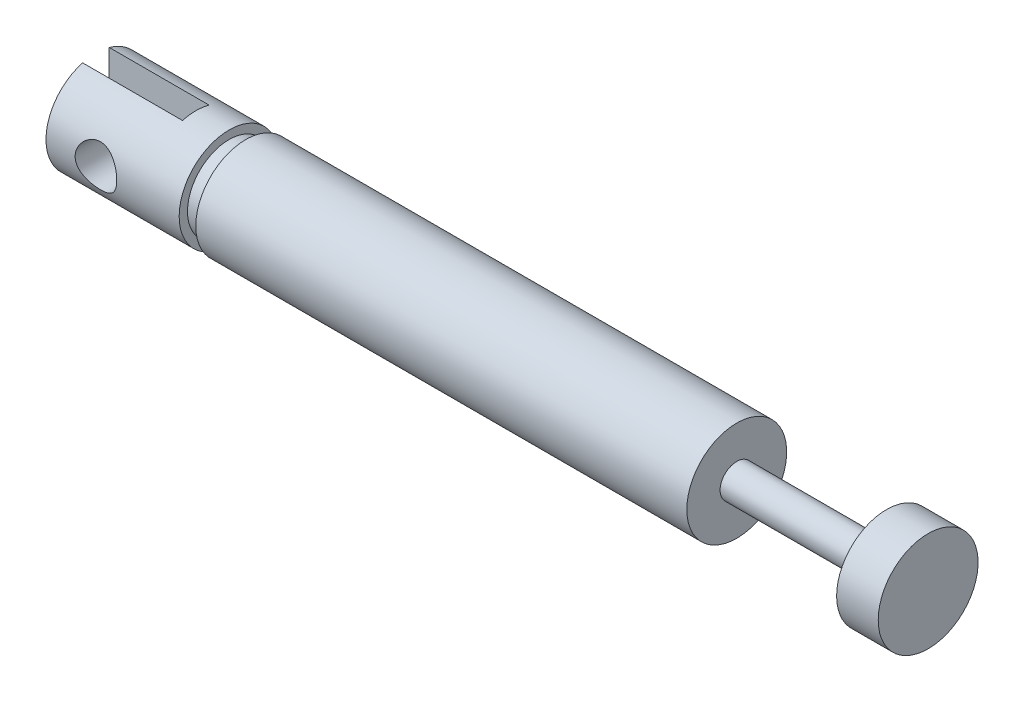
ISO-10303-21;
HEADER;
FILE_DESCRIPTION(('STEP AP214'),'2;1');
FILE_NAME('part.step','',(''),(''),'','','');
FILE_SCHEMA(('AUTOMOTIVE_DESIGN { 1 0 10303 214 1 1 1 1 }'));
ENDSEC;
DATA;
#1=APPLICATION_CONTEXT('core data for automotive mechanical design processes');
#2=APPLICATION_PROTOCOL_DEFINITION('international standard','automotive_design',2000,#1);
#3=PRODUCT_CONTEXT('',#1,'mechanical');
#4=PRODUCT('Part','Part','',(#3));
#5=PRODUCT_RELATED_PRODUCT_CATEGORY('part','',(#4));
#6=PRODUCT_DEFINITION_FORMATION('','',#4);
#7=PRODUCT_DEFINITION_CONTEXT('part definition',#1,'design');
#8=PRODUCT_DEFINITION('design','',#6,#7);
#9=PRODUCT_DEFINITION_SHAPE('','',#8);
#10=(LENGTH_UNIT() NAMED_UNIT(*) SI_UNIT(.MILLI.,.METRE.));
#11=(NAMED_UNIT(*) PLANE_ANGLE_UNIT() SI_UNIT($,.RADIAN.));
#12=(NAMED_UNIT(*) SI_UNIT($,.STERADIAN.) SOLID_ANGLE_UNIT());
#13=UNCERTAINTY_MEASURE_WITH_UNIT(LENGTH_MEASURE(1.E-05),#10,'distance_accuracy_value','');
#14=(GEOMETRIC_REPRESENTATION_CONTEXT(3) GLOBAL_UNCERTAINTY_ASSIGNED_CONTEXT((#13)) GLOBAL_UNIT_ASSIGNED_CONTEXT((#10,
#11,#12)) REPRESENTATION_CONTEXT('',''));
#15=CARTESIAN_POINT('',(0.,0.,0.));
#16=DIRECTION('',(0.,0.,1.));
#17=DIRECTION('',(1.,0.,0.));
#18=AXIS2_PLACEMENT_3D('',#15,#16,#17);
#19=CARTESIAN_POINT('',(0.,0.,0.));
#20=DIRECTION('',(-1.,0.,0.));
#21=DIRECTION('',(0.,0.,1.));
#22=AXIS2_PLACEMENT_3D('',#19,#20,#21);
#23=CYLINDRICAL_SURFACE('',#22,3.);
#24=CARTESIAN_POINT('',(4.25,0.,-3.));
#25=CARTESIAN_POINT('',(4.2499927949087,0.0669580526362673,-2.99999458367273));
#26=CARTESIAN_POINT('',(4.24458804147187,0.134021397063841,-2.9977323297471));
#27=CARTESIAN_POINT('',(4.22316093507982,0.266247371156348,-2.98890153579552));
#28=CARTESIAN_POINT('',(4.20711087553575,0.331404576423565,-2.98232175901028));
#29=CARTESIAN_POINT('',(4.16508890821941,0.457688733653089,-2.96556289038127));
#30=CARTESIAN_POINT('',(4.13915061053185,0.51882852442627,-2.95539599975004));
#31=CARTESIAN_POINT('',(4.07822717676743,0.635829756679804,-2.93245286470664));
#32=CARTESIAN_POINT('',(4.04324478102914,0.691692790015941,-2.91967741092849));
#33=CARTESIAN_POINT('',(3.96337101740912,0.799448403559513,-2.89207828351869));
#34=CARTESIAN_POINT('',(3.91809869121025,0.85104126751777,-2.87718753326093));
#35=CARTESIAN_POINT('',(3.81973566521743,0.946159821091264,-2.84732714068513));
#36=CARTESIAN_POINT('',(3.76664087510549,0.989681263153087,-2.83235746106809));
#37=CARTESIAN_POINT('',(3.65097322243511,1.06953737697066,-2.80321021812995));
#38=CARTESIAN_POINT('',(3.58806255157346,1.10541308153925,-2.78910786873385));
#39=CARTESIAN_POINT('',(3.45642674207907,1.16593940588866,-2.76435572357005));
#40=CARTESIAN_POINT('',(3.38770462051555,1.19059580836291,-2.75370415000823));
#41=CARTESIAN_POINT('',(3.24984630823208,1.22674598312159,-2.73778555387705));
#42=CARTESIAN_POINT('',(3.18088951660785,1.23881657877606,-2.73228387651787));
#43=CARTESIAN_POINT('',(3.04172670731343,1.25125209967797,-2.72661326219504));
#44=CARTESIAN_POINT('',(2.97152139997426,1.25162348054398,-2.7264413842526));
#45=CARTESIAN_POINT('',(2.83759993956506,1.24108450363674,-2.73125119560852));
#46=CARTESIAN_POINT('',(2.77379890343554,1.23103681112301,-2.73583882723623));
#47=CARTESIAN_POINT('',(2.64888790899961,1.20139191015777,-2.74898482773796));
#48=CARTESIAN_POINT('',(2.58777846850823,1.18179287287177,-2.75754395703564));
#49=CARTESIAN_POINT('',(2.46844229700856,1.13321958727571,-2.77786184772756));
#50=CARTESIAN_POINT('',(2.41030457908662,1.10405471539236,-2.78968481949136));
#51=CARTESIAN_POINT('',(2.29952226611985,1.03731242580563,-2.81518331141086));
#52=CARTESIAN_POINT('',(2.24687984938648,0.999731690519547,-2.82885956129779));
#53=CARTESIAN_POINT('',(2.14390004126716,0.913495965543838,-2.85792976877979));
#54=CARTESIAN_POINT('',(2.09413343261456,0.864173483207529,-2.87337121404473));
#55=CARTESIAN_POINT('',(2.00338649704082,0.757729591051515,-2.90325673112529));
#56=CARTESIAN_POINT('',(1.96240822830782,0.700606359448459,-2.9177005687701));
#57=CARTESIAN_POINT('',(1.88956417638373,0.578447948693379,-2.94438283556473));
#58=CARTESIAN_POINT('',(1.85793055484932,0.513260582447682,-2.95656266543334));
#59=CARTESIAN_POINT('',(1.80627886039674,0.377852402526834,-2.97689481414803));
#60=CARTESIAN_POINT('',(1.78625436805618,0.307634394795037,-2.985049358458));
#61=CARTESIAN_POINT('',(1.75958400787336,0.16892811334623,-2.99599641186385));
#62=CARTESIAN_POINT('',(1.75217214255625,0.100611285278641,-2.99909541047125));
#63=CARTESIAN_POINT('',(1.7486537763859,-0.0363546554960877,-3.00056050368745));
#64=CARTESIAN_POINT('',(1.752544029748,-0.105003667152634,-2.99892795711939));
#65=CARTESIAN_POINT('',(1.77097108480606,-0.237098242341434,-2.9913121765694));
#66=CARTESIAN_POINT('',(1.78496995409719,-0.300632966639385,-2.98554887283989));
#67=CARTESIAN_POINT('',(1.82246819454078,-0.42438274897109,-2.97048606772414));
#68=CARTESIAN_POINT('',(1.8459687659503,-0.48459738651836,-2.96118611959704));
#69=CARTESIAN_POINT('',(1.90257097571211,-0.602108999869136,-2.93958270645166));
#70=CARTESIAN_POINT('',(1.93594818314603,-0.659257236855324,-2.92719491469281));
#71=CARTESIAN_POINT('',(2.01105337779169,-0.767346216231429,-2.9007380457909));
#72=CARTESIAN_POINT('',(2.05278485152927,-0.818284352601941,-2.88666826768733));
#73=CARTESIAN_POINT('',(2.1469032332724,-0.916333430274264,-2.85712087895437));
#74=CARTESIAN_POINT('',(2.19983850298626,-0.962910697979836,-2.84161451591029));
#75=CARTESIAN_POINT('',(2.31302127593539,-1.04666984610551,-2.81184336768005));
#76=CARTESIAN_POINT('',(2.37327043517173,-1.08384959285617,-2.79757886493438));
#77=CARTESIAN_POINT('',(2.50061417530257,-1.14815960208699,-2.77181386243988));
#78=CARTESIAN_POINT('',(2.56779403551483,-1.17513918237329,-2.76035562555111));
#79=CARTESIAN_POINT('',(2.7063705938101,-1.21717413951573,-2.74208355658957));
#80=CARTESIAN_POINT('',(2.77776376248335,-1.23223934863688,-2.73526589555752));
#81=CARTESIAN_POINT('',(2.91681869919921,-1.24904080348901,-2.72763164537264));
#82=CARTESIAN_POINT('',(2.98434466229261,-1.25171380413129,-2.72639350967163));
#83=CARTESIAN_POINT('',(3.1188428611411,-1.24615575523912,-2.72893853011024));
#84=CARTESIAN_POINT('',(3.18581518031369,-1.23792637964722,-2.73272091540306));
#85=CARTESIAN_POINT('',(3.31409274746889,-1.21158404780491,-2.74449551302268));
#86=CARTESIAN_POINT('',(3.37551667346339,-1.19394903571466,-2.7522835484648));
#87=CARTESIAN_POINT('',(3.49454802135723,-1.14976328202135,-2.77103181199189));
#88=CARTESIAN_POINT('',(3.55215436539878,-1.12321003517252,-2.78199293131693));
#89=CARTESIAN_POINT('',(3.66569589594912,-1.0601028593549,-2.80666954560013));
#90=CARTESIAN_POINT('',(3.72132233016829,-1.02304360910483,-2.82051102713679));
#91=CARTESIAN_POINT('',(3.82586013936068,-0.940684072630393,-2.84903689053839));
#92=CARTESIAN_POINT('',(3.87476917560057,-0.895380928905621,-2.86372156345875));
#93=CARTESIAN_POINT('',(3.96814868168474,-0.793902045778822,-2.89356392850106));
#94=CARTESIAN_POINT('',(4.01203643284065,-0.737174739949029,-2.90867817511792));
#95=CARTESIAN_POINT('',(4.08969945354363,-0.6166000792532,-2.9366014362202));
#96=CARTESIAN_POINT('',(4.12347011488955,-0.552749497945747,-2.9494093991674));
#97=CARTESIAN_POINT('',(4.17920984543989,-0.420732056717951,-2.97109183362461));
#98=CARTESIAN_POINT('',(4.2013647666173,-0.352653990980636,-2.98002782581964));
#99=CARTESIAN_POINT('',(4.23370632907784,-0.213410421846559,-2.99321009768625));
#100=CARTESIAN_POINT('',(4.24393044252989,-0.142255316980957,-2.99747105811967));
#101=CARTESIAN_POINT('',(4.24933316108645,-0.0472360819191829,-2.99972287568934));
#102=CARTESIAN_POINT('',(4.25000254214922,-0.0236245946756567,-3.00000191102536));
#103=CARTESIAN_POINT('',(4.25,0.,-3.));
#104=B_SPLINE_CURVE_WITH_KNOTS('',3,(#24,#25,#26,#27,#28,#29,#30,#31,#32,#33,#34,#35,#36,#37,
#38,#39,#40,#41,#42,#43,#44,#45,#46,#47,#48,#49,#50,#51,#52,#53,#54,#55,#56,#57,#58,#59,#60,#61,
#62,#63,#64,#65,#66,#67,#68,#69,#70,#71,#72,#73,#74,#75,#76,#77,#78,#79,#80,#81,#82,#83,#84,#85,
#86,#87,#88,#89,#90,#91,#92,#93,#94,#95,#96,#97,#98,#99,#100,#101,#102,#103),.UNSPECIFIED.,.T.,
.F.,(4,2,2,2,2,2,2,2,2,2,2,2,2,2,2,2,2,2,2,2,2,2,2,2,2,2,2,2,2,2,2,2,2,2,2,2,2,2,2,4),(0.,
0.200806918883939,0.402138540628697,0.602791851906303,0.803384436852975,1.01317936288807,
1.22308438131466,1.44331724539125,1.66343646730588,1.87295273137558,2.08235338249046,
2.27570157202557,2.46908679727213,2.66658713058715,2.86416545717207,3.07844141127897,
3.29276749314588,3.51204055060814,3.73119224218298,3.93648443393252,4.14171767493172,
4.33676589735722,4.53183876601786,4.73297135272162,4.93418805469497,5.14978488029295,
5.36543061240342,5.58414788359524,5.80268447074581,6.00439877559645,6.20608211297537,
6.39837649964763,6.59072494950613,6.79463893397442,6.99862373425945,7.2174653500489,
7.43640649428583,7.65172855819386,7.86637250469322,7.93722256499099),.UNSPECIFIED.);
#105=CARTESIAN_POINT('',(4.25,0.,-3.));
#106=VERTEX_POINT('',#105);
#107=EDGE_CURVE('E143',#106,#106,#104,.T.);
#108=ORIENTED_EDGE('',*,*,#107,.T.);
#109=EDGE_LOOP('',(#108));
#110=FACE_BOUND('',#109,.T.);
#111=CARTESIAN_POINT('',(4.25,0.,3.));
#112=CARTESIAN_POINT('',(4.2499927949087,-0.066958052636267,2.99999458367272));
#113=CARTESIAN_POINT('',(4.24458804147187,-0.134021397063841,2.9977323297471));
#114=CARTESIAN_POINT('',(4.22316093507982,-0.266247371156348,2.98890153579552));
#115=CARTESIAN_POINT('',(4.20711087553575,-0.331404576423565,2.98232175901028));
#116=CARTESIAN_POINT('',(4.16508890821941,-0.457688733653089,2.96556289038127));
#117=CARTESIAN_POINT('',(4.13915061053185,-0.51882852442627,2.95539599975004));
#118=CARTESIAN_POINT('',(4.07822717676743,-0.635829756679803,2.93245286470664));
#119=CARTESIAN_POINT('',(4.04324478102913,-0.69169279001594,2.91967741092849));
#120=CARTESIAN_POINT('',(3.96337101740912,-0.799448403559513,2.89207828351869));
#121=CARTESIAN_POINT('',(3.91809869121025,-0.85104126751777,2.87718753326093));
#122=CARTESIAN_POINT('',(3.81973566521743,-0.946159821091264,2.84732714068513));
#123=CARTESIAN_POINT('',(3.76664087510549,-0.989681263153087,2.83235746106809));
#124=CARTESIAN_POINT('',(3.6509732224351,-1.06953737697066,2.80321021812995));
#125=CARTESIAN_POINT('',(3.58806255157346,-1.10541308153925,2.78910786873385));
#126=CARTESIAN_POINT('',(3.45642674207907,-1.16593940588866,2.76435572357005));
#127=CARTESIAN_POINT('',(3.38770462051555,-1.19059580836291,2.75370415000823));
#128=CARTESIAN_POINT('',(3.24984630823208,-1.22674598312159,2.73778555387705));
#129=CARTESIAN_POINT('',(3.18088951660784,-1.23881657877606,2.73228387651787));
#130=CARTESIAN_POINT('',(3.04172670731343,-1.25125209967796,2.72661326219504));
#131=CARTESIAN_POINT('',(2.97152139997426,-1.25162348054397,2.7264413842526));
#132=CARTESIAN_POINT('',(2.83759993956506,-1.24108450363674,2.73125119560852));
#133=CARTESIAN_POINT('',(2.77379890343554,-1.23103681112301,2.73583882723623));
#134=CARTESIAN_POINT('',(2.64888790899961,-1.20139191015777,2.74898482773796));
#135=CARTESIAN_POINT('',(2.58777846850823,-1.18179287287177,2.75754395703564));
#136=CARTESIAN_POINT('',(2.46844229700856,-1.13321958727571,2.77786184772756));
#137=CARTESIAN_POINT('',(2.41030457908662,-1.10405471539236,2.78968481949136));
#138=CARTESIAN_POINT('',(2.29952226611985,-1.03731242580563,2.81518331141086));
#139=CARTESIAN_POINT('',(2.24687984938648,-0.999731690519546,2.82885956129779));
#140=CARTESIAN_POINT('',(2.14390004126716,-0.913495965543837,2.85792976877979));
#141=CARTESIAN_POINT('',(2.09413343261456,-0.864173483207528,2.87337121404473));
#142=CARTESIAN_POINT('',(2.00338649704082,-0.757729591051513,2.90325673112529));
#143=CARTESIAN_POINT('',(1.96240822830782,-0.700606359448458,2.9177005687701));
#144=CARTESIAN_POINT('',(1.88956417638373,-0.578447948693377,2.94438283556473));
#145=CARTESIAN_POINT('',(1.85793055484932,-0.513260582447681,2.95656266543334));
#146=CARTESIAN_POINT('',(1.80627886039674,-0.377852402526832,2.97689481414803));
#147=CARTESIAN_POINT('',(1.78625436805618,-0.307634394795035,2.985049358458));
#148=CARTESIAN_POINT('',(1.75958400787336,-0.168928113346228,2.99599641186385));
#149=CARTESIAN_POINT('',(1.75217214255625,-0.100611285278639,2.99909541047125));
#150=CARTESIAN_POINT('',(1.7486537763859,0.0363546554960896,3.00056050368745));
#151=CARTESIAN_POINT('',(1.752544029748,0.105003667152636,2.99892795711939));
#152=CARTESIAN_POINT('',(1.77097108480606,0.237098242341436,2.9913121765694));
#153=CARTESIAN_POINT('',(1.78496995409719,0.300632966639387,2.9855488728399));
#154=CARTESIAN_POINT('',(1.82246819454078,0.424382748971092,2.97048606772414));
#155=CARTESIAN_POINT('',(1.8459687659503,0.484597386518362,2.96118611959704));
#156=CARTESIAN_POINT('',(1.90257097571211,0.602108999869138,2.93958270645166));
#157=CARTESIAN_POINT('',(1.93594818314603,0.659257236855325,2.92719491469281));
#158=CARTESIAN_POINT('',(2.01105337779169,0.767346216231431,2.9007380457909));
#159=CARTESIAN_POINT('',(2.05278485152927,0.818284352601943,2.88666826768733));
#160=CARTESIAN_POINT('',(2.14690323327241,0.916333430274266,2.85712087895437));
#161=CARTESIAN_POINT('',(2.19983850298626,0.962910697979838,2.84161451591029));
#162=CARTESIAN_POINT('',(2.31302127593539,1.04666984610551,2.81184336768005));
#163=CARTESIAN_POINT('',(2.37327043517173,1.08384959285618,2.79757886493438));
#164=CARTESIAN_POINT('',(2.50061417530257,1.14815960208699,2.77181386243988));
#165=CARTESIAN_POINT('',(2.56779403551483,1.17513918237329,2.76035562555111));
#166=CARTESIAN_POINT('',(2.70637059381011,1.21717413951573,2.74208355658957));
#167=CARTESIAN_POINT('',(2.77776376248335,1.23223934863688,2.73526589555752));
#168=CARTESIAN_POINT('',(2.91681869919921,1.24904080348901,2.72763164537264));
#169=CARTESIAN_POINT('',(2.98434466229262,1.25171380413129,2.72639350967162));
#170=CARTESIAN_POINT('',(3.1188428611411,1.24615575523912,2.72893853011024));
#171=CARTESIAN_POINT('',(3.18581518031369,1.23792637964722,2.73272091540306));
#172=CARTESIAN_POINT('',(3.31409274746889,1.21158404780491,2.74449551302268));
#173=CARTESIAN_POINT('',(3.37551667346339,1.19394903571466,2.7522835484648));
#174=CARTESIAN_POINT('',(3.49454802135723,1.14976328202135,2.77103181199189));
#175=CARTESIAN_POINT('',(3.55215436539878,1.12321003517252,2.78199293131693));
#176=CARTESIAN_POINT('',(3.66569589594912,1.0601028593549,2.80666954560013));
#177=CARTESIAN_POINT('',(3.72132233016829,1.02304360910483,2.82051102713679));
#178=CARTESIAN_POINT('',(3.82586013936068,0.940684072630393,2.84903689053839));
#179=CARTESIAN_POINT('',(3.87476917560057,0.895380928905621,2.86372156345875));
#180=CARTESIAN_POINT('',(3.96814868168474,0.793902045778823,2.89356392850106));
#181=CARTESIAN_POINT('',(4.01203643284065,0.73717473994903,2.90867817511791));
#182=CARTESIAN_POINT('',(4.08969945354363,0.616600079253201,2.9366014362202));
#183=CARTESIAN_POINT('',(4.12347011488955,0.552749497945748,2.9494093991674));
#184=CARTESIAN_POINT('',(4.17920984543989,0.420732056717952,2.97109183362461));
#185=CARTESIAN_POINT('',(4.2013647666173,0.352653990980637,2.98002782581964));
#186=CARTESIAN_POINT('',(4.23370632907784,0.213410421846559,2.99321009768625));
#187=CARTESIAN_POINT('',(4.24393044252989,0.142255316980958,2.99747105811967));
#188=CARTESIAN_POINT('',(4.24933316108645,0.0472360819191835,2.99972287568934));
#189=CARTESIAN_POINT('',(4.25000254214922,0.0236245946756572,3.00000191102536));
#190=CARTESIAN_POINT('',(4.25,0.,3.));
#191=B_SPLINE_CURVE_WITH_KNOTS('',3,(#111,#112,#113,#114,#115,#116,#117,#118,#119,#120,#121,
#122,#123,#124,#125,#126,#127,#128,#129,#130,#131,#132,#133,#134,#135,#136,#137,#138,#139,#140,
#141,#142,#143,#144,#145,#146,#147,#148,#149,#150,#151,#152,#153,#154,#155,#156,#157,#158,#159,
#160,#161,#162,#163,#164,#165,#166,#167,#168,#169,#170,#171,#172,#173,#174,#175,#176,#177,#178,
#179,#180,#181,#182,#183,#184,#185,#186,#187,#188,#189,#190),.UNSPECIFIED.,.T.,.F.,(4,2,2,2,2,2,
2,2,2,2,2,2,2,2,2,2,2,2,2,2,2,2,2,2,2,2,2,2,2,2,2,2,2,2,2,2,2,2,2,4),(0.,0.200806918883939,
0.402138540628697,0.602791851906302,0.803384436852976,1.01317936288807,1.22308438131466,
1.44331724539126,1.66343646730588,1.87295273137558,2.08235338249046,2.27570157202557,
2.46908679727213,2.66658713058715,2.86416545717207,3.07844141127897,3.29276749314588,
3.51204055060814,3.73119224218298,3.93648443393251,4.14171767493172,4.33676589735722,
4.53183876601786,4.73297135272162,4.93418805469497,5.14978488029295,5.36543061240342,
5.58414788359524,5.80268447074581,6.00439877559645,6.20608211297537,6.39837649964764,
6.59072494950614,6.79463893397442,6.99862373425945,7.2174653500489,7.43640649428583,
7.65172855819386,7.86637250469322,7.93722256499099),.UNSPECIFIED.);
#192=CARTESIAN_POINT('',(4.25,0.,3.));
#193=VERTEX_POINT('',#192);
#194=EDGE_CURVE('E136',#193,#193,#191,.T.);
#195=ORIENTED_EDGE('',*,*,#194,.T.);
#196=EDGE_LOOP('',(#195));
#197=FACE_BOUND('',#196,.T.);
#198=CARTESIAN_POINT('',(8.,0.,0.));
#199=DIRECTION('',(-1.,0.,0.));
#200=DIRECTION('',(0.,0.,1.));
#201=AXIS2_PLACEMENT_3D('',#198,#199,#200);
#202=CIRCLE('',#201,3.);
#203=CARTESIAN_POINT('',(8.,0.,3.));
#204=VERTEX_POINT('',#203);
#205=EDGE_CURVE('E133',#204,#204,#202,.T.);
#206=ORIENTED_EDGE('',*,*,#205,.T.);
#207=EDGE_LOOP('',(#206));
#208=FACE_BOUND('',#207,.T.);
#209=DIRECTION('',(-1.,0.,0.));
#210=VECTOR('',#209,1.);
#211=CARTESIAN_POINT('',(0.,2.89136645896019,-0.8));
#212=LINE('',#211,#210);
#213=CARTESIAN_POINT('',(6.,2.89136645896019,-0.8));
#214=VERTEX_POINT('',#213);
#215=CARTESIAN_POINT('',(0.,2.89136645896019,-0.8));
#216=VERTEX_POINT('',#215);
#217=EDGE_CURVE('E105',#214,#216,#212,.T.);
#218=ORIENTED_EDGE('',*,*,#217,.F.);
#219=CARTESIAN_POINT('',(6.,0.,0.));
#220=DIRECTION('',(1.,0.,0.));
#221=DIRECTION('',(0.,0.,-1.));
#222=AXIS2_PLACEMENT_3D('',#219,#220,#221);
#223=CIRCLE('',#222,3.);
#224=CARTESIAN_POINT('',(6.,2.89136645896019,0.8));
#225=VERTEX_POINT('',#224);
#226=EDGE_CURVE('E44',#214,#225,#223,.T.);
#227=ORIENTED_EDGE('',*,*,#226,.T.);
#228=DIRECTION('',(-1.,0.,0.));
#229=VECTOR('',#228,1.);
#230=CARTESIAN_POINT('',(0.,2.89136645896019,0.8));
#231=LINE('',#230,#229);
#232=CARTESIAN_POINT('',(0.,2.89136645896019,0.8));
#233=VERTEX_POINT('',#232);
#234=EDGE_CURVE('E87',#225,#233,#231,.T.);
#235=ORIENTED_EDGE('',*,*,#234,.T.);
#236=CARTESIAN_POINT('',(0.,0.,0.));
#237=DIRECTION('',(-1.,0.,0.));
#238=DIRECTION('',(0.,0.,1.));
#239=AXIS2_PLACEMENT_3D('',#236,#237,#238);
#240=CIRCLE('',#239,3.);
#241=CARTESIAN_POINT('',(0.,-2.89136645896019,0.8));
#242=VERTEX_POINT('',#241);
#243=EDGE_CURVE('E93',#242,#233,#240,.T.);
#244=ORIENTED_EDGE('',*,*,#243,.F.);
#245=DIRECTION('',(-1.,0.,0.));
#246=VECTOR('',#245,1.);
#247=CARTESIAN_POINT('',(0.,-2.89136645896019,0.8));
#248=LINE('',#247,#246);
#249=CARTESIAN_POINT('',(6.,-2.89136645896019,0.8));
#250=VERTEX_POINT('',#249);
#251=EDGE_CURVE('E55',#242,#250,#248,.F.);
#252=ORIENTED_EDGE('',*,*,#251,.T.);
#253=CARTESIAN_POINT('',(6.,-2.89136645896019,-0.8));
#254=VERTEX_POINT('',#253);
#255=EDGE_CURVE('E11',#250,#254,#223,.T.);
#256=ORIENTED_EDGE('',*,*,#255,.T.);
#257=DIRECTION('',(-1.,0.,0.));
#258=VECTOR('',#257,1.);
#259=CARTESIAN_POINT('',(0.,-2.89136645896019,-0.8));
#260=LINE('',#259,#258);
#261=CARTESIAN_POINT('',(0.,-2.89136645896019,-0.8));
#262=VERTEX_POINT('',#261);
#263=EDGE_CURVE('E103',#262,#254,#260,.F.);
#264=ORIENTED_EDGE('',*,*,#263,.F.);
#265=EDGE_CURVE('E108',#216,#262,#240,.T.);
#266=ORIENTED_EDGE('',*,*,#265,.F.);
#267=EDGE_LOOP('',(#218,#227,#235,#244,#252,#256,#264,#266));
#268=FACE_BOUND('',#267,.T.);
#269=ADVANCED_FACE('F40',(#110,#197,#208,#268),#23,.T.);
#270=CARTESIAN_POINT('',(0.,3.,0.));
#271=DIRECTION('',(1.,0.,0.));
#272=DIRECTION('',(0.,0.,-1.));
#273=AXIS2_PLACEMENT_3D('',#270,#271,#272);
#274=PLANE('',#273);
#275=DIRECTION('',(0.,1.,0.));
#276=VECTOR('',#275,1.);
#277=CARTESIAN_POINT('',(0.,-3.,-0.8));
#278=LINE('',#277,#276);
#279=EDGE_CURVE('E99',#262,#216,#278,.T.);
#280=ORIENTED_EDGE('',*,*,#279,.T.);
#281=ORIENTED_EDGE('',*,*,#265,.T.);
#282=EDGE_LOOP('',(#280,#281));
#283=FACE_BOUND('',#282,.T.);
#284=ADVANCED_FACE('F161',(#283),#274,.F.);
#285=CARTESIAN_POINT('',(3.,0.,-3.));
#286=DIRECTION('',(0.,0.,1.));
#287=DIRECTION('',(1.,0.,0.));
#288=AXIS2_PLACEMENT_3D('',#285,#286,#287);
#289=CYLINDRICAL_SURFACE('',#288,1.25);
#290=ORIENTED_EDGE('',*,*,#107,.F.);
#291=EDGE_LOOP('',(#290));
#292=FACE_BOUND('',#291,.T.);
#293=CARTESIAN_POINT('',(3.,0.,-0.8));
#294=DIRECTION('',(0.,0.,1.));
#295=DIRECTION('',(1.,0.,0.));
#296=AXIS2_PLACEMENT_3D('',#293,#294,#295);
#297=CIRCLE('',#296,1.25);
#298=CARTESIAN_POINT('',(4.25,0.,-0.8));
#299=VERTEX_POINT('',#298);
#300=EDGE_CURVE('E96',#299,#299,#297,.F.);
#301=ORIENTED_EDGE('',*,*,#300,.F.);
#302=EDGE_LOOP('',(#301));
#303=FACE_BOUND('',#302,.T.);
#304=ADVANCED_FACE('F154',(#292,#303),#289,.F.);
#305=CARTESIAN_POINT('',(8.,3.,0.));
#306=DIRECTION('',(-1.,0.,0.));
#307=DIRECTION('',(0.,0.,1.));
#308=AXIS2_PLACEMENT_3D('',#305,#306,#307);
#309=PLANE('',#308);
#310=ORIENTED_EDGE('',*,*,#205,.F.);
#311=EDGE_LOOP('',(#310));
#312=FACE_BOUND('',#311,.T.);
#313=CARTESIAN_POINT('',(8.,0.,0.));
#314=DIRECTION('',(-1.,0.,0.));
#315=DIRECTION('',(0.,0.,1.));
#316=AXIS2_PLACEMENT_3D('',#313,#314,#315);
#317=CIRCLE('',#316,2.5);
#318=CARTESIAN_POINT('',(8.,0.,2.5));
#319=VERTEX_POINT('',#318);
#320=EDGE_CURVE('E130',#319,#319,#317,.T.);
#321=ORIENTED_EDGE('',*,*,#320,.T.);
#322=EDGE_LOOP('',(#321));
#323=FACE_BOUND('',#322,.T.);
#324=ADVANCED_FACE('F191',(#312,#323),#309,.F.);
#325=CARTESIAN_POINT('',(0.,0.,0.));
#326=DIRECTION('',(-1.,0.,0.));
#327=DIRECTION('',(0.,0.,1.));
#328=AXIS2_PLACEMENT_3D('',#325,#326,#327);
#329=CYLINDRICAL_SURFACE('',#328,2.5);
#330=ORIENTED_EDGE('',*,*,#320,.F.);
#331=EDGE_LOOP('',(#330));
#332=FACE_BOUND('',#331,.T.);
#333=CARTESIAN_POINT('',(9.,0.,0.));
#334=DIRECTION('',(-1.,0.,0.));
#335=DIRECTION('',(0.,0.,1.));
#336=AXIS2_PLACEMENT_3D('',#333,#334,#335);
#337=CIRCLE('',#336,2.5);
#338=CARTESIAN_POINT('',(9.,0.,2.5));
#339=VERTEX_POINT('',#338);
#340=EDGE_CURVE('E127',#339,#339,#337,.T.);
#341=ORIENTED_EDGE('',*,*,#340,.T.);
#342=EDGE_LOOP('',(#341));
#343=FACE_BOUND('',#342,.T.);
#344=ADVANCED_FACE('F188',(#332,#343),#329,.T.);
#345=CARTESIAN_POINT('',(9.,2.5,0.));
#346=DIRECTION('',(1.,0.,0.));
#347=DIRECTION('',(0.,0.,-1.));
#348=AXIS2_PLACEMENT_3D('',#345,#346,#347);
#349=PLANE('',#348);
#350=ORIENTED_EDGE('',*,*,#340,.F.);
#351=EDGE_LOOP('',(#350));
#352=FACE_BOUND('',#351,.T.);
#353=CARTESIAN_POINT('',(9.,0.,0.));
#354=DIRECTION('',(-1.,0.,0.));
#355=DIRECTION('',(0.,0.,1.));
#356=AXIS2_PLACEMENT_3D('',#353,#354,#355);
#357=CIRCLE('',#356,3.);
#358=CARTESIAN_POINT('',(9.,0.,3.));
#359=VERTEX_POINT('',#358);
#360=EDGE_CURVE('E124',#359,#359,#357,.T.);
#361=ORIENTED_EDGE('',*,*,#360,.T.);
#362=EDGE_LOOP('',(#361));
#363=FACE_BOUND('',#362,.T.);
#364=ADVANCED_FACE('F184',(#352,#363),#349,.F.);
#365=CARTESIAN_POINT('',(0.,0.,0.));
#366=DIRECTION('',(-1.,0.,0.));
#367=DIRECTION('',(0.,0.,1.));
#368=AXIS2_PLACEMENT_3D('',#365,#366,#367);
#369=CYLINDRICAL_SURFACE('',#368,3.);
#370=ORIENTED_EDGE('',*,*,#360,.F.);
#371=EDGE_LOOP('',(#370));
#372=FACE_BOUND('',#371,.T.);
#373=CARTESIAN_POINT('',(38.5,0.,0.));
#374=DIRECTION('',(-1.,0.,0.));
#375=DIRECTION('',(0.,0.,1.));
#376=AXIS2_PLACEMENT_3D('',#373,#374,#375);
#377=CIRCLE('',#376,3.);
#378=CARTESIAN_POINT('',(38.5,0.,3.));
#379=VERTEX_POINT('',#378);
#380=EDGE_CURVE('E121',#379,#379,#377,.T.);
#381=ORIENTED_EDGE('',*,*,#380,.T.);
#382=EDGE_LOOP('',(#381));
#383=FACE_BOUND('',#382,.T.);
#384=ADVANCED_FACE('F180',(#372,#383),#369,.T.);
#385=CARTESIAN_POINT('',(38.5,3.,0.));
#386=DIRECTION('',(-1.,0.,0.));
#387=DIRECTION('',(0.,0.,1.));
#388=AXIS2_PLACEMENT_3D('',#385,#386,#387);
#389=PLANE('',#388);
#390=ORIENTED_EDGE('',*,*,#380,.F.);
#391=EDGE_LOOP('',(#390));
#392=FACE_BOUND('',#391,.T.);
#393=CARTESIAN_POINT('',(38.5,0.,0.));
#394=DIRECTION('',(-1.,0.,0.));
#395=DIRECTION('',(0.,0.,1.));
#396=AXIS2_PLACEMENT_3D('',#393,#394,#395);
#397=CIRCLE('',#396,1.);
#398=CARTESIAN_POINT('',(38.5,0.,1.));
#399=VERTEX_POINT('',#398);
#400=EDGE_CURVE('E118',#399,#399,#397,.T.);
#401=ORIENTED_EDGE('',*,*,#400,.T.);
#402=EDGE_LOOP('',(#401));
#403=FACE_BOUND('',#402,.T.);
#404=ADVANCED_FACE('F176',(#392,#403),#389,.F.);
#405=CARTESIAN_POINT('',(0.,0.,0.));
#406=DIRECTION('',(-1.,0.,0.));
#407=DIRECTION('',(0.,0.,1.));
#408=AXIS2_PLACEMENT_3D('',#405,#406,#407);
#409=CYLINDRICAL_SURFACE('',#408,1.);
#410=ORIENTED_EDGE('',*,*,#400,.F.);
#411=EDGE_LOOP('',(#410));
#412=FACE_BOUND('',#411,.T.);
#413=CARTESIAN_POINT('',(47.5,0.,0.));
#414=DIRECTION('',(-1.,0.,0.));
#415=DIRECTION('',(0.,0.,1.));
#416=AXIS2_PLACEMENT_3D('',#413,#414,#415);
#417=CIRCLE('',#416,1.);
#418=CARTESIAN_POINT('',(47.5,0.,1.));
#419=VERTEX_POINT('',#418);
#420=EDGE_CURVE('E115',#419,#419,#417,.T.);
#421=ORIENTED_EDGE('',*,*,#420,.T.);
#422=EDGE_LOOP('',(#421));
#423=FACE_BOUND('',#422,.T.);
#424=ADVANCED_FACE('F172',(#412,#423),#409,.T.);
#425=CARTESIAN_POINT('',(47.5,1.,0.));
#426=DIRECTION('',(1.,0.,0.));
#427=DIRECTION('',(0.,0.,-1.));
#428=AXIS2_PLACEMENT_3D('',#425,#426,#427);
#429=PLANE('',#428);
#430=ORIENTED_EDGE('',*,*,#420,.F.);
#431=EDGE_LOOP('',(#430));
#432=FACE_BOUND('',#431,.T.);
#433=CARTESIAN_POINT('',(47.5,0.,0.));
#434=DIRECTION('',(-1.,0.,0.));
#435=DIRECTION('',(0.,0.,1.));
#436=AXIS2_PLACEMENT_3D('',#433,#434,#435);
#437=CIRCLE('',#436,3.);
#438=CARTESIAN_POINT('',(47.5,0.,3.));
#439=VERTEX_POINT('',#438);
#440=EDGE_CURVE('E112',#439,#439,#437,.T.);
#441=ORIENTED_EDGE('',*,*,#440,.T.);
#442=EDGE_LOOP('',(#441));
#443=FACE_BOUND('',#442,.T.);
#444=ADVANCED_FACE('F168',(#432,#443),#429,.F.);
#445=CARTESIAN_POINT('',(0.,0.,0.));
#446=DIRECTION('',(-1.,0.,0.));
#447=DIRECTION('',(0.,0.,1.));
#448=AXIS2_PLACEMENT_3D('',#445,#446,#447);
#449=CYLINDRICAL_SURFACE('',#448,3.);
#450=ORIENTED_EDGE('',*,*,#440,.F.);
#451=EDGE_LOOP('',(#450));
#452=FACE_BOUND('',#451,.T.);
#453=CARTESIAN_POINT('',(50.,0.,0.));
#454=DIRECTION('',(-1.,0.,0.));
#455=DIRECTION('',(0.,0.,1.));
#456=AXIS2_PLACEMENT_3D('',#453,#454,#455);
#457=CIRCLE('',#456,3.);
#458=CARTESIAN_POINT('',(50.,0.,3.));
#459=VERTEX_POINT('',#458);
#460=EDGE_CURVE('E109',#459,#459,#457,.T.);
#461=ORIENTED_EDGE('',*,*,#460,.T.);
#462=EDGE_LOOP('',(#461));
#463=FACE_BOUND('',#462,.T.);
#464=ADVANCED_FACE('F164',(#452,#463),#449,.T.);
#465=CARTESIAN_POINT('',(50.,3.,0.));
#466=DIRECTION('',(-1.,0.,0.));
#467=DIRECTION('',(0.,0.,1.));
#468=AXIS2_PLACEMENT_3D('',#465,#466,#467);
#469=PLANE('',#468);
#470=ORIENTED_EDGE('',*,*,#460,.F.);
#471=EDGE_LOOP('',(#470));
#472=FACE_BOUND('',#471,.T.);
#473=ADVANCED_FACE('F159',(#472),#469,.F.);
#474=ORIENTED_EDGE('',*,*,#243,.T.);
#475=DIRECTION('',(0.,1.,0.));
#476=VECTOR('',#475,1.);
#477=CARTESIAN_POINT('',(0.,-3.,0.8));
#478=LINE('',#477,#476);
#479=EDGE_CURVE('E88',#242,#233,#478,.T.);
#480=ORIENTED_EDGE('',*,*,#479,.F.);
#481=EDGE_LOOP('',(#474,#480));
#482=FACE_BOUND('',#481,.T.);
#483=ADVANCED_FACE('F152',(#482),#274,.F.);
#484=CARTESIAN_POINT('',(3.,0.,0.8));
#485=DIRECTION('',(0.,0.,1.));
#486=DIRECTION('',(1.,0.,0.));
#487=AXIS2_PLACEMENT_3D('',#484,#485,#486);
#488=CIRCLE('',#487,1.25);
#489=CARTESIAN_POINT('',(4.25,0.,0.8));
#490=VERTEX_POINT('',#489);
#491=EDGE_CURVE('E94',#490,#490,#488,.F.);
#492=ORIENTED_EDGE('',*,*,#491,.T.);
#493=EDGE_LOOP('',(#492));
#494=FACE_BOUND('',#493,.T.);
#495=ORIENTED_EDGE('',*,*,#194,.F.);
#496=EDGE_LOOP('',(#495));
#497=FACE_BOUND('',#496,.T.);
#498=ADVANCED_FACE('F147',(#494,#497),#289,.F.);
#499=CARTESIAN_POINT('',(6.,-3.,0.));
#500=DIRECTION('',(1.,0.,0.));
#501=DIRECTION('',(0.,0.,-1.));
#502=AXIS2_PLACEMENT_3D('',#499,#500,#501);
#503=PLANE('',#502);
#504=DIRECTION('',(0.,1.,0.));
#505=VECTOR('',#504,1.);
#506=CARTESIAN_POINT('',(6.,-3.,-0.8));
#507=LINE('',#506,#505);
#508=EDGE_CURVE('E82',#254,#214,#507,.T.);
#509=ORIENTED_EDGE('',*,*,#508,.F.);
#510=ORIENTED_EDGE('',*,*,#255,.F.);
#511=DIRECTION('',(0.,1.,0.));
#512=VECTOR('',#511,1.);
#513=CARTESIAN_POINT('',(6.,-3.,0.8));
#514=LINE('',#513,#512);
#515=EDGE_CURVE('E81',#250,#225,#514,.T.);
#516=ORIENTED_EDGE('',*,*,#515,.T.);
#517=ORIENTED_EDGE('',*,*,#226,.F.);
#518=EDGE_LOOP('',(#509,#510,#516,#517));
#519=FACE_BOUND('',#518,.T.);
#520=ADVANCED_FACE('F80',(#519),#503,.F.);
#521=CARTESIAN_POINT('',(0.,-3.,-0.8));
#522=DIRECTION('',(0.,0.,1.));
#523=DIRECTION('',(1.,0.,0.));
#524=AXIS2_PLACEMENT_3D('',#521,#522,#523);
#525=PLANE('',#524);
#526=ORIENTED_EDGE('',*,*,#300,.T.);
#527=EDGE_LOOP('',(#526));
#528=FACE_BOUND('',#527,.T.);
#529=ORIENTED_EDGE('',*,*,#217,.T.);
#530=ORIENTED_EDGE('',*,*,#279,.F.);
#531=ORIENTED_EDGE('',*,*,#263,.T.);
#532=ORIENTED_EDGE('',*,*,#508,.T.);
#533=EDGE_LOOP('',(#529,#530,#531,#532));
#534=FACE_BOUND('',#533,.T.);
#535=ADVANCED_FACE('F217',(#528,#534),#525,.T.);
#536=CARTESIAN_POINT('',(0.,-3.,0.8));
#537=DIRECTION('',(0.,0.,1.));
#538=DIRECTION('',(1.,0.,0.));
#539=AXIS2_PLACEMENT_3D('',#536,#537,#538);
#540=PLANE('',#539);
#541=ORIENTED_EDGE('',*,*,#491,.F.);
#542=EDGE_LOOP('',(#541));
#543=FACE_BOUND('',#542,.T.);
#544=ORIENTED_EDGE('',*,*,#515,.F.);
#545=ORIENTED_EDGE('',*,*,#251,.F.);
#546=ORIENTED_EDGE('',*,*,#479,.T.);
#547=ORIENTED_EDGE('',*,*,#234,.F.);
#548=EDGE_LOOP('',(#544,#545,#546,#547));
#549=FACE_BOUND('',#548,.T.);
#550=ADVANCED_FACE('F85',(#543,#549),#540,.F.);
#551=CLOSED_SHELL('',(#269,#284,#304,#324,#344,#364,#384,#404,#424,#444,#464,#473,#483,#498,
#520,#535,#550));
#552=MANIFOLD_SOLID_BREP('B2',#551);
#553=ADVANCED_BREP_SHAPE_REPRESENTATION('',(#18,#552),#14);
#554=SHAPE_DEFINITION_REPRESENTATION(#9,#553);
ENDSEC;
END-ISO-10303-21;
